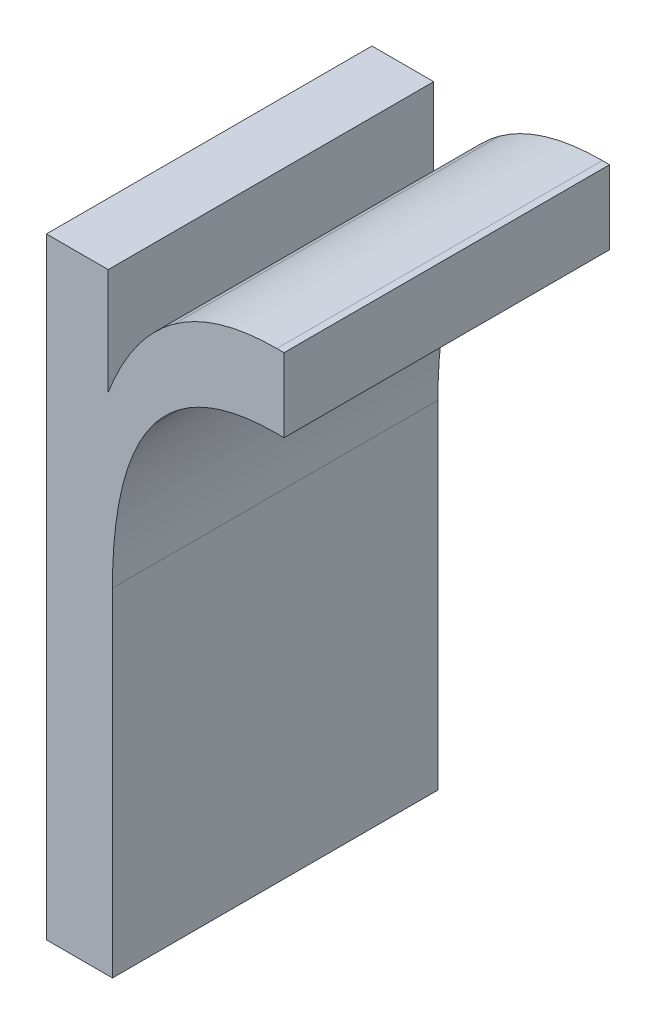
ISO-10303-21;
HEADER;
FILE_DESCRIPTION(('STEP AP214'),'2;1');
FILE_NAME('part.step','',(''),(''),'','','');
FILE_SCHEMA(('AUTOMOTIVE_DESIGN { 1 0 10303 214 1 1 1 1 }'));
ENDSEC;
DATA;
#1=APPLICATION_CONTEXT('core data for automotive mechanical design processes');
#2=APPLICATION_PROTOCOL_DEFINITION('international standard','automotive_design',2000,#1);
#3=PRODUCT_CONTEXT('',#1,'mechanical');
#4=PRODUCT('Part','Part','',(#3));
#5=PRODUCT_RELATED_PRODUCT_CATEGORY('part','',(#4));
#6=PRODUCT_DEFINITION_FORMATION('','',#4);
#7=PRODUCT_DEFINITION_CONTEXT('part definition',#1,'design');
#8=PRODUCT_DEFINITION('design','',#6,#7);
#9=PRODUCT_DEFINITION_SHAPE('','',#8);
#10=(LENGTH_UNIT() NAMED_UNIT(*) SI_UNIT(.MILLI.,.METRE.));
#11=(NAMED_UNIT(*) PLANE_ANGLE_UNIT() SI_UNIT($,.RADIAN.));
#12=(NAMED_UNIT(*) SI_UNIT($,.STERADIAN.) SOLID_ANGLE_UNIT());
#13=UNCERTAINTY_MEASURE_WITH_UNIT(LENGTH_MEASURE(1.E-05),#10,'distance_accuracy_value','');
#14=(GEOMETRIC_REPRESENTATION_CONTEXT(3) GLOBAL_UNCERTAINTY_ASSIGNED_CONTEXT((#13)) GLOBAL_UNIT_ASSIGNED_CONTEXT((#10,
#11,#12)) REPRESENTATION_CONTEXT('',''));
#15=CARTESIAN_POINT('',(0.,0.,0.));
#16=DIRECTION('',(0.,0.,1.));
#17=DIRECTION('',(1.,0.,0.));
#18=AXIS2_PLACEMENT_3D('',#15,#16,#17);
#19=CARTESIAN_POINT('',(5.905156204129,-4.99246632073869,19.2));
#20=DIRECTION('',(0.,0.,-1.));
#21=DIRECTION('',(0.,-1.,0.));
#22=AXIS2_PLACEMENT_3D('',#19,#20,#21);
#23=PLANE('',#22);
#24=DIRECTION('',(0.,1.,0.));
#25=VECTOR('',#24,1.);
#26=CARTESIAN_POINT('',(5.701613646968,-6.13847583919,19.2));
#27=LINE('',#26,#25);
#28=CARTESIAN_POINT('',(5.701613646968,-6.13848085651183,19.2));
#29=VERTEX_POINT('',#28);
#30=CARTESIAN_POINT('',(5.701613646968,-4.260241794746,19.2));
#31=VERTEX_POINT('',#30);
#32=EDGE_CURVE('E198',#29,#31,#27,.T.);
#33=ORIENTED_EDGE('',*,*,#32,.T.);
#34=DIRECTION('',(1.,0.,0.));
#35=VECTOR('',#34,1.);
#36=CARTESIAN_POINT('',(5.701613646968,-4.260241794746,19.2));
#37=LINE('',#36,#35);
#38=CARTESIAN_POINT('',(5.89143066919,-4.260241794746,19.2));
#39=VERTEX_POINT('',#38);
#40=EDGE_CURVE('E181',#31,#39,#37,.T.);
#41=ORIENTED_EDGE('',*,*,#40,.T.);
#42=DIRECTION('',(0.,-1.,0.));
#43=VECTOR('',#42,1.);
#44=CARTESIAN_POINT('',(5.89143066919,-4.260241794746,19.2));
#45=LINE('',#44,#43);
#46=CARTESIAN_POINT('',(5.89143066919,-4.586132261412,19.2));
#47=VERTEX_POINT('',#46);
#48=EDGE_CURVE('E262',#39,#47,#45,.T.);
#49=ORIENTED_EDGE('',*,*,#48,.T.);
#50=CARTESIAN_POINT('',(5.89143066919,-4.586132261412,19.2));
#51=CARTESIAN_POINT('',(5.939941846968,-4.46067883919,19.2));
#52=CARTESIAN_POINT('',(6.007023246968,-4.366746816968,19.2));
#53=CARTESIAN_POINT('',(6.09305586919,-4.304474483634,19.2));
#54=(BOUNDED_CURVE() B_SPLINE_CURVE(3,(#50,#51,#52,#53),.UNSPECIFIED.,.F.,
.F.) B_SPLINE_CURVE_WITH_KNOTS((4,4),(0.,1.),
.UNSPECIFIED.) CURVE() GEOMETRIC_REPRESENTATION_ITEM() RATIONAL_B_SPLINE_CURVE((1.,1.,1.,1.)) REPRESENTATION_ITEM(''));
#55=CARTESIAN_POINT('',(6.09305586919,-4.304474483634,19.2));
#56=VERTEX_POINT('',#55);
#57=EDGE_CURVE('E112',#47,#56,#54,.T.);
#58=ORIENTED_EDGE('',*,*,#57,.T.);
#59=CARTESIAN_POINT('',(6.09305586919,-4.304474483634,19.2));
#60=CARTESIAN_POINT('',(6.178814735857,-4.242202150301,19.2));
#61=CARTESIAN_POINT('',(6.284066691412,-4.211135128079,19.2));
#62=CARTESIAN_POINT('',(6.409325380301,-4.211135128079,19.2));
#63=(BOUNDED_CURVE() B_SPLINE_CURVE(3,(#59,#60,#61,#62),.UNSPECIFIED.,.F.,
.F.) B_SPLINE_CURVE_WITH_KNOTS((4,4),(0.,1.),
.UNSPECIFIED.) CURVE() GEOMETRIC_REPRESENTATION_ITEM() RATIONAL_B_SPLINE_CURVE((1.,1.,1.,1.)) REPRESENTATION_ITEM(''));
#64=CARTESIAN_POINT('',(6.409325380301,-4.211135128079,19.2));
#65=VERTEX_POINT('',#64);
#66=EDGE_CURVE('E191',#56,#65,#63,.T.);
#67=ORIENTED_EDGE('',*,*,#66,.T.);
#68=DIRECTION('',(1.,0.,0.));
#69=VECTOR('',#68,1.);
#70=CARTESIAN_POINT('',(6.409325380301,-4.211135128079,19.2));
#71=LINE('',#70,#69);
#72=CARTESIAN_POINT('',(6.431601180301,-4.211135128079,19.2));
#73=VERTEX_POINT('',#72);
#74=EDGE_CURVE('E202',#65,#73,#71,.T.);
#75=ORIENTED_EDGE('',*,*,#74,.T.);
#76=DIRECTION('',(0.,-1.,0.));
#77=VECTOR('',#76,1.);
#78=CARTESIAN_POINT('',(6.431601180301,-4.211135128079,19.2));
#79=LINE('',#78,#77);
#80=CARTESIAN_POINT('',(6.431601180301,-4.437457594746,19.2));
#81=VERTEX_POINT('',#80);
#82=EDGE_CURVE('E196',#73,#81,#79,.T.);
#83=ORIENTED_EDGE('',*,*,#82,.T.);
#84=DIRECTION('',(-1.,0.,0.));
#85=VECTOR('',#84,1.);
#86=CARTESIAN_POINT('',(6.431601180301,-4.437457594746,19.2));
#87=LINE('',#86,#85);
#88=CARTESIAN_POINT('',(6.406285846968,-4.437457594746,19.2));
#89=VERTEX_POINT('',#88);
#90=EDGE_CURVE('E160',#81,#89,#87,.T.);
#91=ORIENTED_EDGE('',*,*,#90,.T.);
#92=CARTESIAN_POINT('',(144.098351651215,-187.334838055489,19.2));
#93=DIRECTION('',(0.,0.,1.));
#94=DIRECTION('',(0.602463983442453,-0.798146069748296,0.));
#95=AXIS2_PLACEMENT_3D('',#92,#93,#94);
#96=ELLIPSE('',#95,229.043025205647,9.39427208332016);
#97=CARTESIAN_POINT('',(6.029815513635,-4.603886861412,19.2));
#98=VERTEX_POINT('',#97);
#99=EDGE_CURVE('E157',#89,#98,#96,.T.);
#100=ORIENTED_EDGE('',*,*,#99,.T.);
#101=CARTESIAN_POINT('',(6.029815513635,-4.603886861412,19.2));
#102=CARTESIAN_POINT('',(5.946308780301,-4.714828416968,19.2));
#103=CARTESIAN_POINT('',(5.904421358079,-4.880348928079,19.2));
#104=CARTESIAN_POINT('',(5.904421358079,-5.101069283634,19.2));
#105=(BOUNDED_CURVE() B_SPLINE_CURVE(3,(#101,#102,#103,#104),.UNSPECIFIED.,.F.,
.F.) B_SPLINE_CURVE_WITH_KNOTS((4,4),(0.,1.),
.UNSPECIFIED.) CURVE() GEOMETRIC_REPRESENTATION_ITEM() RATIONAL_B_SPLINE_CURVE((1.,1.,1.,1.)) REPRESENTATION_ITEM(''));
#106=CARTESIAN_POINT('',(5.904421358079,-5.101069283634,19.2));
#107=VERTEX_POINT('',#106);
#108=EDGE_CURVE('E145',#98,#107,#105,.T.);
#109=ORIENTED_EDGE('',*,*,#108,.T.);
#110=DIRECTION('',(0.,-1.,0.));
#111=VECTOR('',#110,1.);
#112=CARTESIAN_POINT('',(5.904421358079,-5.101069283634,19.2));
#113=LINE('',#112,#111);
#114=CARTESIAN_POINT('',(5.904421358079,-6.138481483634,19.2));
#115=VERTEX_POINT('',#114);
#116=EDGE_CURVE('E183',#107,#115,#113,.T.);
#117=ORIENTED_EDGE('',*,*,#116,.T.);
#118=DIRECTION('',(-1.,0.,0.));
#119=VECTOR('',#118,1.);
#120=CARTESIAN_POINT('',(5.904421358079,-6.138481483634,19.2));
#121=LINE('',#120,#119);
#122=EDGE_CURVE('E11',#115,#29,#121,.T.);
#123=ORIENTED_EDGE('',*,*,#122,.T.);
#124=EDGE_LOOP('',(#33,#41,#49,#58,#67,#75,#83,#91,#100,#109,#117,#123));
#125=FACE_BOUND('',#124,.T.);
#126=ADVANCED_FACE('F16',(#125),#23,.T.);
#127=CARTESIAN_POINT('',(5.905156204129,-4.99246632073869,20.2));
#128=DIRECTION('',(0.,0.,-1.));
#129=DIRECTION('',(0.,-1.,0.));
#130=AXIS2_PLACEMENT_3D('',#127,#128,#129);
#131=PLANE('',#130);
#132=DIRECTION('',(-1.,0.,0.));
#133=VECTOR('',#132,1.);
#134=CARTESIAN_POINT('',(5.904421358079,-6.138481483634,20.2));
#135=LINE('',#134,#133);
#136=CARTESIAN_POINT('',(5.904421358079,-6.138481483634,20.2));
#137=VERTEX_POINT('',#136);
#138=CARTESIAN_POINT('',(5.701613646968,-6.1384808565118,20.2));
#139=VERTEX_POINT('',#138);
#140=EDGE_CURVE('E27',#137,#139,#135,.T.);
#141=ORIENTED_EDGE('',*,*,#140,.F.);
#142=DIRECTION('',(0.,-1.,0.));
#143=VECTOR('',#142,1.);
#144=CARTESIAN_POINT('',(5.904421358079,-5.101069283634,20.2));
#145=LINE('',#144,#143);
#146=CARTESIAN_POINT('',(5.904421358079,-5.101069283634,20.2));
#147=VERTEX_POINT('',#146);
#148=EDGE_CURVE('E137',#147,#137,#145,.T.);
#149=ORIENTED_EDGE('',*,*,#148,.F.);
#150=CARTESIAN_POINT('',(6.029815513635,-4.603886861412,20.2));
#151=CARTESIAN_POINT('',(5.946308780301,-4.714828416968,20.2));
#152=CARTESIAN_POINT('',(5.904421358079,-4.880348928079,20.2));
#153=CARTESIAN_POINT('',(5.904421358079,-5.101069283634,20.2));
#154=(BOUNDED_CURVE() B_SPLINE_CURVE(3,(#150,#151,#152,#153),.UNSPECIFIED.,.F.,
.F.) B_SPLINE_CURVE_WITH_KNOTS((4,4),(0.,1.),
.UNSPECIFIED.) CURVE() GEOMETRIC_REPRESENTATION_ITEM() RATIONAL_B_SPLINE_CURVE((1.,1.,1.,1.)) REPRESENTATION_ITEM(''));
#155=CARTESIAN_POINT('',(6.029815513635,-4.603886861412,20.2));
#156=VERTEX_POINT('',#155);
#157=EDGE_CURVE('E165',#156,#147,#154,.T.);
#158=ORIENTED_EDGE('',*,*,#157,.F.);
#159=CARTESIAN_POINT('',(144.098351651215,-187.334838055489,20.2));
#160=DIRECTION('',(0.,0.,1.));
#161=DIRECTION('',(0.602463983442453,-0.798146069748296,0.));
#162=AXIS2_PLACEMENT_3D('',#159,#160,#161);
#163=ELLIPSE('',#162,229.043025205647,9.39427208332016);
#164=CARTESIAN_POINT('',(6.406285846968,-4.437457594746,20.2));
#165=VERTEX_POINT('',#164);
#166=EDGE_CURVE('E20',#165,#156,#163,.T.);
#167=ORIENTED_EDGE('',*,*,#166,.F.);
#168=DIRECTION('',(-1.,0.,0.));
#169=VECTOR('',#168,1.);
#170=CARTESIAN_POINT('',(6.431601180301,-4.437457594746,20.2));
#171=LINE('',#170,#169);
#172=CARTESIAN_POINT('',(6.431601180301,-4.437457594746,20.2));
#173=VERTEX_POINT('',#172);
#174=EDGE_CURVE('E231',#173,#165,#171,.T.);
#175=ORIENTED_EDGE('',*,*,#174,.F.);
#176=DIRECTION('',(0.,-1.,0.));
#177=VECTOR('',#176,1.);
#178=CARTESIAN_POINT('',(6.431601180301,-4.211135128079,20.2));
#179=LINE('',#178,#177);
#180=CARTESIAN_POINT('',(6.431601180301,-4.211135128079,20.2));
#181=VERTEX_POINT('',#180);
#182=EDGE_CURVE('E197',#181,#173,#179,.T.);
#183=ORIENTED_EDGE('',*,*,#182,.F.);
#184=DIRECTION('',(1.,0.,0.));
#185=VECTOR('',#184,1.);
#186=CARTESIAN_POINT('',(6.409325380301,-4.211135128079,20.2));
#187=LINE('',#186,#185);
#188=CARTESIAN_POINT('',(6.409325380301,-4.211135128079,20.2));
#189=VERTEX_POINT('',#188);
#190=EDGE_CURVE('E237',#189,#181,#187,.T.);
#191=ORIENTED_EDGE('',*,*,#190,.F.);
#192=CARTESIAN_POINT('',(6.09305586919,-4.304474483634,20.2));
#193=CARTESIAN_POINT('',(6.178814735857,-4.242202150301,20.2));
#194=CARTESIAN_POINT('',(6.284066691412,-4.211135128079,20.2));
#195=CARTESIAN_POINT('',(6.409325380301,-4.211135128079,20.2));
#196=(BOUNDED_CURVE() B_SPLINE_CURVE(3,(#192,#193,#194,#195),.UNSPECIFIED.,.F.,
.F.) B_SPLINE_CURVE_WITH_KNOTS((4,4),(0.,1.),
.UNSPECIFIED.) CURVE() GEOMETRIC_REPRESENTATION_ITEM() RATIONAL_B_SPLINE_CURVE((1.,1.,1.,1.)) REPRESENTATION_ITEM(''));
#197=CARTESIAN_POINT('',(6.09305586919,-4.304474483634,20.2));
#198=VERTEX_POINT('',#197);
#199=EDGE_CURVE('E97',#198,#189,#196,.T.);
#200=ORIENTED_EDGE('',*,*,#199,.F.);
#201=CARTESIAN_POINT('',(5.89143066919,-4.586132261412,20.2));
#202=CARTESIAN_POINT('',(5.939941846968,-4.46067883919,20.2));
#203=CARTESIAN_POINT('',(6.007023246968,-4.366746816968,20.2));
#204=CARTESIAN_POINT('',(6.09305586919,-4.304474483634,20.2));
#205=(BOUNDED_CURVE() B_SPLINE_CURVE(3,(#201,#202,#203,#204),.UNSPECIFIED.,.F.,
.F.) B_SPLINE_CURVE_WITH_KNOTS((4,4),(0.,1.),
.UNSPECIFIED.) CURVE() GEOMETRIC_REPRESENTATION_ITEM() RATIONAL_B_SPLINE_CURVE((1.,1.,1.,1.)) REPRESENTATION_ITEM(''));
#206=CARTESIAN_POINT('',(5.89143066919,-4.586132261412,20.2));
#207=VERTEX_POINT('',#206);
#208=EDGE_CURVE('E271',#207,#198,#205,.T.);
#209=ORIENTED_EDGE('',*,*,#208,.F.);
#210=DIRECTION('',(0.,-1.,0.));
#211=VECTOR('',#210,1.);
#212=CARTESIAN_POINT('',(5.89143066919,-4.260241794746,20.2));
#213=LINE('',#212,#211);
#214=CARTESIAN_POINT('',(5.89143066919,-4.260241794746,20.2));
#215=VERTEX_POINT('',#214);
#216=EDGE_CURVE('E263',#215,#207,#213,.T.);
#217=ORIENTED_EDGE('',*,*,#216,.F.);
#218=DIRECTION('',(1.,0.,0.));
#219=VECTOR('',#218,1.);
#220=CARTESIAN_POINT('',(5.701613646968,-4.260241794746,20.2));
#221=LINE('',#220,#219);
#222=CARTESIAN_POINT('',(5.701613646968,-4.260241794746,20.2));
#223=VERTEX_POINT('',#222);
#224=EDGE_CURVE('E182',#223,#215,#221,.T.);
#225=ORIENTED_EDGE('',*,*,#224,.F.);
#226=DIRECTION('',(0.,1.,0.));
#227=VECTOR('',#226,1.);
#228=CARTESIAN_POINT('',(5.701613646968,-6.13847583919,20.2));
#229=LINE('',#228,#227);
#230=EDGE_CURVE('E176',#139,#223,#229,.T.);
#231=ORIENTED_EDGE('',*,*,#230,.F.);
#232=EDGE_LOOP('',(#141,#149,#158,#167,#175,#183,#191,#200,#209,#217,#225,#231));
#233=FACE_BOUND('',#232,.T.);
#234=ADVANCED_FACE('F325',(#233),#131,.F.);
#235=CARTESIAN_POINT('',(5.8030175025235,-6.138481483634,19.19));
#236=DIRECTION('',(0.,1.,0.));
#237=DIRECTION('',(1.,0.,0.));
#238=AXIS2_PLACEMENT_3D('',#235,#236,#237);
#239=PLANE('',#238);
#240=DIRECTION('',(0.,0.,-1.));
#241=VECTOR('',#240,1.);
#242=CARTESIAN_POINT('',(5.904421358079,-6.138481483634,20.2));
#243=LINE('',#242,#241);
#244=EDGE_CURVE('E186',#137,#115,#243,.T.);
#245=ORIENTED_EDGE('',*,*,#244,.F.);
#246=ORIENTED_EDGE('',*,*,#140,.T.);
#247=DIRECTION('',(0.,0.,-1.));
#248=VECTOR('',#247,1.);
#249=CARTESIAN_POINT('',(5.701613646968,-6.138481483634,19.19));
#250=LINE('',#249,#248);
#251=EDGE_CURVE('E209',#139,#29,#250,.T.);
#252=ORIENTED_EDGE('',*,*,#251,.T.);
#253=ORIENTED_EDGE('',*,*,#122,.F.);
#254=EDGE_LOOP('',(#245,#246,#252,#253));
#255=FACE_BOUND('',#254,.T.);
#256=ADVANCED_FACE('F18',(#255),#239,.F.);
#257=CARTESIAN_POINT('',(5.904421358079,-5.619775383634,19.19));
#258=DIRECTION('',(-1.,0.,0.));
#259=DIRECTION('',(0.,1.,0.));
#260=AXIS2_PLACEMENT_3D('',#257,#258,#259);
#261=PLANE('',#260);
#262=DIRECTION('',(0.,0.,-1.));
#263=VECTOR('',#262,1.);
#264=CARTESIAN_POINT('',(5.904421358079,-5.101069283634,20.2));
#265=LINE('',#264,#263);
#266=EDGE_CURVE('E152',#147,#107,#265,.T.);
#267=ORIENTED_EDGE('',*,*,#266,.F.);
#268=ORIENTED_EDGE('',*,*,#148,.T.);
#269=ORIENTED_EDGE('',*,*,#244,.T.);
#270=ORIENTED_EDGE('',*,*,#116,.F.);
#271=EDGE_LOOP('',(#267,#268,#269,#270));
#272=FACE_BOUND('',#271,.T.);
#273=ADVANCED_FACE('F358',(#272),#261,.F.);
#274=CARTESIAN_POINT('',(6.029815513635,-4.603886861412,19.1975994573501));
#275=CARTESIAN_POINT('',(6.029815513635,-4.603886861412,20.2024005426499));
#276=CARTESIAN_POINT('',(5.946308780301,-4.714828416968,19.1975994573501));
#277=CARTESIAN_POINT('',(5.946308780301,-4.714828416968,20.2024005426499));
#278=CARTESIAN_POINT('',(5.904421358079,-4.880348928079,19.1975994573501));
#279=CARTESIAN_POINT('',(5.904421358079,-4.880348928079,20.2024005426499));
#280=CARTESIAN_POINT('',(5.904421358079,-5.101069283634,19.1975994573501));
#281=CARTESIAN_POINT('',(5.904421358079,-5.101069283634,20.2024005426499));
#282=(BOUNDED_SURFACE() B_SPLINE_SURFACE(3,1,((#274,#275),(#276,#277),(#278,#279),(#280,#281)),
.UNSPECIFIED.,.F.,.F.,.F.) B_SPLINE_SURFACE_WITH_KNOTS((4,4),(2,2),(0.,1.),(-1.00240054264991,
0.00240054264990928),
.UNSPECIFIED.) GEOMETRIC_REPRESENTATION_ITEM() RATIONAL_B_SPLINE_SURFACE(((1.,1.),(1.,1.),(1.,
1.),(1.,1.))) REPRESENTATION_ITEM('') SURFACE());
#283=DIRECTION('',(0.,0.,-1.));
#284=VECTOR('',#283,1.);
#285=CARTESIAN_POINT('',(6.029815513635,-4.603886861412,20.2));
#286=LINE('',#285,#284);
#287=EDGE_CURVE('E150',#156,#98,#286,.T.);
#288=ORIENTED_EDGE('',*,*,#287,.F.);
#289=ORIENTED_EDGE('',*,*,#157,.T.);
#290=ORIENTED_EDGE('',*,*,#266,.T.);
#291=ORIENTED_EDGE('',*,*,#108,.F.);
#292=EDGE_LOOP('',(#288,#289,#290,#291));
#293=FACE_BOUND('',#292,.T.);
#294=ADVANCED_FACE('F147',(#293),#282,.F.);
#295=CARTESIAN_POINT('',(6.40751688184207,-4.43745859483211,20.2));
#296=CARTESIAN_POINT('',(6.22461006201338,-4.43716159008577,20.2));
#297=CARTESIAN_POINT('',(6.10817830344771,-4.52504768625873,20.2));
#298=CARTESIAN_POINT('',(6.06387266564196,-4.55849087730186,20.2));
#299=CARTESIAN_POINT('',(6.02920597019018,-4.60469733340791,20.2));
#300=CARTESIAN_POINT('',(6.40751688184207,-4.43745859483211,19.2));
#301=CARTESIAN_POINT('',(6.22461006201338,-4.43716159008577,19.2));
#302=CARTESIAN_POINT('',(6.10817830344771,-4.52504768625873,19.2));
#303=CARTESIAN_POINT('',(6.06387266564196,-4.55849087730186,19.2));
#304=CARTESIAN_POINT('',(6.02920597019018,-4.60469733340791,19.2));
#305=(BOUNDED_SURFACE() B_SPLINE_SURFACE(1,2,((#295,#296,#297,#298,#299),(#300,#301,#302,#303,
#304)),.UNSPECIFIED.,.F.,.F.,.F.) B_SPLINE_SURFACE_WITH_KNOTS((2,2),(3,2,3),
(-0.00437660501009774,-1.06062387625208E-05),(1431.26709260127,1439.11751611832,
1442.11670221386),
.UNSPECIFIED.) GEOMETRIC_REPRESENTATION_ITEM() RATIONAL_B_SPLINE_SURFACE(((0.98749698177734,
0.993609039464239,1.,0.997558389055784,0.995157485534068),(0.98749698177734,0.993609039464239,
1.,0.997558389055784,0.995157485534068))) REPRESENTATION_ITEM('') SURFACE());
#306=DIRECTION('',(0.,0.,-1.));
#307=VECTOR('',#306,1.);
#308=CARTESIAN_POINT('',(6.406285846968,-4.437457594746,20.2));
#309=LINE('',#308,#307);
#310=EDGE_CURVE('E229',#165,#89,#309,.T.);
#311=ORIENTED_EDGE('',*,*,#310,.F.);
#312=ORIENTED_EDGE('',*,*,#166,.T.);
#313=ORIENTED_EDGE('',*,*,#287,.T.);
#314=ORIENTED_EDGE('',*,*,#99,.F.);
#315=EDGE_LOOP('',(#311,#312,#313,#314));
#316=FACE_BOUND('',#315,.T.);
#317=ADVANCED_FACE('F167',(#316),#305,.F.);
#318=CARTESIAN_POINT('',(6.4189435136345,-4.437457594746,19.19));
#319=DIRECTION('',(0.,1.,0.));
#320=DIRECTION('',(1.,0.,0.));
#321=AXIS2_PLACEMENT_3D('',#318,#319,#320);
#322=PLANE('',#321);
#323=DIRECTION('',(0.,0.,-1.));
#324=VECTOR('',#323,1.);
#325=CARTESIAN_POINT('',(6.431601180301,-4.437457594746,20.2));
#326=LINE('',#325,#324);
#327=EDGE_CURVE('E192',#173,#81,#326,.T.);
#328=ORIENTED_EDGE('',*,*,#327,.F.);
#329=ORIENTED_EDGE('',*,*,#174,.T.);
#330=ORIENTED_EDGE('',*,*,#310,.T.);
#331=ORIENTED_EDGE('',*,*,#90,.F.);
#332=EDGE_LOOP('',(#328,#329,#330,#331));
#333=FACE_BOUND('',#332,.T.);
#334=ADVANCED_FACE('F370',(#333),#322,.F.);
#335=CARTESIAN_POINT('',(6.431601180301,-4.3242963614125,19.19));
#336=DIRECTION('',(-1.,0.,0.));
#337=DIRECTION('',(0.,0.,1.));
#338=AXIS2_PLACEMENT_3D('',#335,#336,#337);
#339=PLANE('',#338);
#340=DIRECTION('',(0.,0.,-1.));
#341=VECTOR('',#340,1.);
#342=CARTESIAN_POINT('',(6.431601180301,-4.211135128079,20.2));
#343=LINE('',#342,#341);
#344=EDGE_CURVE('E206',#181,#73,#343,.T.);
#345=ORIENTED_EDGE('',*,*,#344,.F.);
#346=ORIENTED_EDGE('',*,*,#182,.T.);
#347=ORIENTED_EDGE('',*,*,#327,.T.);
#348=ORIENTED_EDGE('',*,*,#82,.F.);
#349=EDGE_LOOP('',(#345,#346,#347,#348));
#350=FACE_BOUND('',#349,.T.);
#351=ADVANCED_FACE('F319',(#350),#339,.F.);
#352=CARTESIAN_POINT('',(6.420463280301,-4.211135128079,19.19));
#353=DIRECTION('',(0.,-1.,0.));
#354=DIRECTION('',(0.,0.,-1.));
#355=AXIS2_PLACEMENT_3D('',#352,#353,#354);
#356=PLANE('',#355);
#357=DIRECTION('',(0.,0.,-1.));
#358=VECTOR('',#357,1.);
#359=CARTESIAN_POINT('',(6.409325380301,-4.211135128079,20.2));
#360=LINE('',#359,#358);
#361=EDGE_CURVE('E187',#189,#65,#360,.T.);
#362=ORIENTED_EDGE('',*,*,#361,.F.);
#363=ORIENTED_EDGE('',*,*,#190,.T.);
#364=ORIENTED_EDGE('',*,*,#344,.T.);
#365=ORIENTED_EDGE('',*,*,#74,.F.);
#366=EDGE_LOOP('',(#362,#363,#364,#365));
#367=FACE_BOUND('',#366,.T.);
#368=ADVANCED_FACE('F317',(#367),#356,.F.);
#369=CARTESIAN_POINT('',(6.09305586919,-4.304474483634,19.1968548457589));
#370=CARTESIAN_POINT('',(6.09305586919,-4.304474483634,20.2031451542411));
#371=CARTESIAN_POINT('',(6.178814735857,-4.242202150301,19.1968548457589));
#372=CARTESIAN_POINT('',(6.178814735857,-4.242202150301,20.2031451542411));
#373=CARTESIAN_POINT('',(6.284066691412,-4.211135128079,19.1968548457589));
#374=CARTESIAN_POINT('',(6.284066691412,-4.211135128079,20.2031451542411));
#375=CARTESIAN_POINT('',(6.409325380301,-4.211135128079,19.1968548457589));
#376=CARTESIAN_POINT('',(6.409325380301,-4.211135128079,20.2031451542411));
#377=(BOUNDED_SURFACE() B_SPLINE_SURFACE(3,1,((#369,#370),(#371,#372),(#373,#374),(#375,#376)),
.UNSPECIFIED.,.F.,.F.,.F.) B_SPLINE_SURFACE_WITH_KNOTS((4,4),(2,2),(0.,1.),(-1.00314515424111,
0.00314515424110848),
.UNSPECIFIED.) GEOMETRIC_REPRESENTATION_ITEM() RATIONAL_B_SPLINE_SURFACE(((1.,1.),(1.,1.),(1.,
1.),(1.,1.))) REPRESENTATION_ITEM('') SURFACE());
#378=DIRECTION('',(0.,0.,-1.));
#379=VECTOR('',#378,1.);
#380=CARTESIAN_POINT('',(6.09305586919,-4.304474483634,20.2));
#381=LINE('',#380,#379);
#382=EDGE_CURVE('E245',#198,#56,#381,.T.);
#383=ORIENTED_EDGE('',*,*,#382,.F.);
#384=ORIENTED_EDGE('',*,*,#199,.T.);
#385=ORIENTED_EDGE('',*,*,#361,.T.);
#386=ORIENTED_EDGE('',*,*,#66,.F.);
#387=EDGE_LOOP('',(#383,#384,#385,#386));
#388=FACE_BOUND('',#387,.T.);
#389=ADVANCED_FACE('F322',(#388),#377,.F.);
#390=CARTESIAN_POINT('',(5.89143066919,-4.586132261412,19.1968614093543));
#391=CARTESIAN_POINT('',(5.89143066919,-4.586132261412,20.2031385906458));
#392=CARTESIAN_POINT('',(5.939941846968,-4.46067883919,19.1968614093543));
#393=CARTESIAN_POINT('',(5.939941846968,-4.46067883919,20.2031385906458));
#394=CARTESIAN_POINT('',(6.007023246968,-4.366746816968,19.1968614093543));
#395=CARTESIAN_POINT('',(6.007023246968,-4.366746816968,20.2031385906458));
#396=CARTESIAN_POINT('',(6.09305586919,-4.304474483634,19.1968614093543));
#397=CARTESIAN_POINT('',(6.09305586919,-4.304474483634,20.2031385906458));
#398=(BOUNDED_SURFACE() B_SPLINE_SURFACE(3,1,((#390,#391),(#392,#393),(#394,#395),(#396,#397)),
.UNSPECIFIED.,.F.,.F.,.F.) B_SPLINE_SURFACE_WITH_KNOTS((4,4),(2,2),(0.,1.),(-1.00313859064575,
0.00313859064575312),
.UNSPECIFIED.) GEOMETRIC_REPRESENTATION_ITEM() RATIONAL_B_SPLINE_SURFACE(((1.,1.),(1.,1.),(1.,
1.),(1.,1.))) REPRESENTATION_ITEM('') SURFACE());
#399=DIRECTION('',(0.,0.,-1.));
#400=VECTOR('',#399,1.);
#401=CARTESIAN_POINT('',(5.89143066919,-4.586132261412,20.2));
#402=LINE('',#401,#400);
#403=EDGE_CURVE('E258',#207,#47,#402,.T.);
#404=ORIENTED_EDGE('',*,*,#403,.F.);
#405=ORIENTED_EDGE('',*,*,#208,.T.);
#406=ORIENTED_EDGE('',*,*,#382,.T.);
#407=ORIENTED_EDGE('',*,*,#57,.F.);
#408=EDGE_LOOP('',(#404,#405,#406,#407));
#409=FACE_BOUND('',#408,.T.);
#410=ADVANCED_FACE('F323',(#409),#398,.F.);
#411=CARTESIAN_POINT('',(5.89143066919,-4.423187028079,19.19));
#412=DIRECTION('',(-1.,0.,0.));
#413=DIRECTION('',(0.,0.,1.));
#414=AXIS2_PLACEMENT_3D('',#411,#412,#413);
#415=PLANE('',#414);
#416=DIRECTION('',(0.,0.,-1.));
#417=VECTOR('',#416,1.);
#418=CARTESIAN_POINT('',(5.89143066919,-4.260241794746,20.2));
#419=LINE('',#418,#417);
#420=EDGE_CURVE('E178',#215,#39,#419,.T.);
#421=ORIENTED_EDGE('',*,*,#420,.F.);
#422=ORIENTED_EDGE('',*,*,#216,.T.);
#423=ORIENTED_EDGE('',*,*,#403,.T.);
#424=ORIENTED_EDGE('',*,*,#48,.F.);
#425=EDGE_LOOP('',(#421,#422,#423,#424));
#426=FACE_BOUND('',#425,.T.);
#427=ADVANCED_FACE('F328',(#426),#415,.F.);
#428=CARTESIAN_POINT('',(5.796522158079,-4.260241794746,19.19));
#429=DIRECTION('',(0.,-1.,0.));
#430=DIRECTION('',(0.,0.,-1.));
#431=AXIS2_PLACEMENT_3D('',#428,#429,#430);
#432=PLANE('',#431);
#433=DIRECTION('',(0.,0.,-1.));
#434=VECTOR('',#433,1.);
#435=CARTESIAN_POINT('',(5.701613646968,-4.260241794746,20.2));
#436=LINE('',#435,#434);
#437=EDGE_CURVE('E201',#223,#31,#436,.T.);
#438=ORIENTED_EDGE('',*,*,#437,.F.);
#439=ORIENTED_EDGE('',*,*,#224,.T.);
#440=ORIENTED_EDGE('',*,*,#420,.T.);
#441=ORIENTED_EDGE('',*,*,#40,.F.);
#442=EDGE_LOOP('',(#438,#439,#440,#441));
#443=FACE_BOUND('',#442,.T.);
#444=ADVANCED_FACE('F330',(#443),#432,.F.);
#445=CARTESIAN_POINT('',(5.701613646968,-5.199358816968,19.19));
#446=DIRECTION('',(1.,0.,0.));
#447=DIRECTION('',(0.,1.,0.));
#448=AXIS2_PLACEMENT_3D('',#445,#446,#447);
#449=PLANE('',#448);
#450=ORIENTED_EDGE('',*,*,#251,.F.);
#451=ORIENTED_EDGE('',*,*,#230,.T.);
#452=ORIENTED_EDGE('',*,*,#437,.T.);
#453=ORIENTED_EDGE('',*,*,#32,.F.);
#454=EDGE_LOOP('',(#450,#451,#452,#453));
#455=FACE_BOUND('',#454,.T.);
#456=ADVANCED_FACE('F331',(#455),#449,.F.);
#457=CLOSED_SHELL('',(#126,#234,#256,#273,#294,#317,#334,#351,#368,#389,#410,#427,#444,#456));
#458=MANIFOLD_SOLID_BREP('B1',#457);
#459=ADVANCED_BREP_SHAPE_REPRESENTATION('',(#18,#458),#14);
#460=SHAPE_DEFINITION_REPRESENTATION(#9,#459);
ENDSEC;
END-ISO-10303-21;
